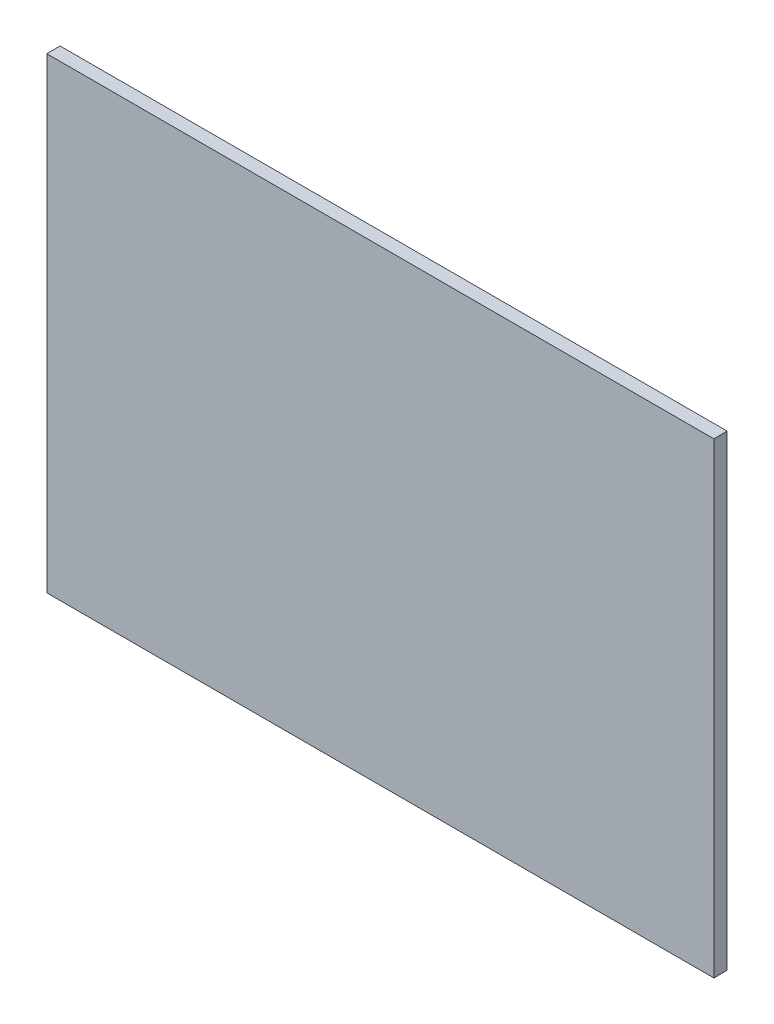
ISO-10303-21;
HEADER;
FILE_DESCRIPTION(('STEP AP214'),'2;1');
FILE_NAME('part.step','',(''),(''),'','','');
FILE_SCHEMA(('AUTOMOTIVE_DESIGN { 1 0 10303 214 1 1 1 1 }'));
ENDSEC;
DATA;
#1=APPLICATION_CONTEXT('core data for automotive mechanical design processes');
#2=APPLICATION_PROTOCOL_DEFINITION('international standard','automotive_design',2000,#1);
#3=PRODUCT_CONTEXT('',#1,'mechanical');
#4=PRODUCT('Part','Part','',(#3));
#5=PRODUCT_RELATED_PRODUCT_CATEGORY('part','',(#4));
#6=PRODUCT_DEFINITION_FORMATION('','',#4);
#7=PRODUCT_DEFINITION_CONTEXT('part definition',#1,'design');
#8=PRODUCT_DEFINITION('design','',#6,#7);
#9=PRODUCT_DEFINITION_SHAPE('','',#8);
#10=(LENGTH_UNIT() NAMED_UNIT(*) SI_UNIT(.MILLI.,.METRE.));
#11=(NAMED_UNIT(*) PLANE_ANGLE_UNIT() SI_UNIT($,.RADIAN.));
#12=(NAMED_UNIT(*) SI_UNIT($,.STERADIAN.) SOLID_ANGLE_UNIT());
#13=UNCERTAINTY_MEASURE_WITH_UNIT(LENGTH_MEASURE(1.E-05),#10,'distance_accuracy_value','');
#14=(GEOMETRIC_REPRESENTATION_CONTEXT(3) GLOBAL_UNCERTAINTY_ASSIGNED_CONTEXT((#13)) GLOBAL_UNIT_ASSIGNED_CONTEXT((#10,
#11,#12)) REPRESENTATION_CONTEXT('',''));
#15=CARTESIAN_POINT('',(0.,0.,0.));
#16=DIRECTION('',(0.,0.,1.));
#17=DIRECTION('',(1.,0.,0.));
#18=AXIS2_PLACEMENT_3D('',#15,#16,#17);
#19=CARTESIAN_POINT('',(528.664259927798,29.3862815884477,20.));
#20=DIRECTION('',(0.,-1.,0.));
#21=DIRECTION('',(1.,0.,0.));
#22=AXIS2_PLACEMENT_3D('',#19,#20,#21);
#23=PLANE('',#22);
#24=DIRECTION('',(-1.,0.,0.));
#25=VECTOR('',#24,1.);
#26=CARTESIAN_POINT('',(528.664259927798,29.3862815884477,0.));
#27=LINE('',#26,#25);
#28=CARTESIAN_POINT('',(528.664259927798,29.3862815884477,0.));
#29=VERTEX_POINT('',#28);
#30=CARTESIAN_POINT('',(-471.335740072202,29.3862815884476,0.));
#31=VERTEX_POINT('',#30);
#32=EDGE_CURVE('E107',#29,#31,#27,.T.);
#33=ORIENTED_EDGE('',*,*,#32,.T.);
#34=DIRECTION('',(0.,0.,-1.));
#35=VECTOR('',#34,1.);
#36=CARTESIAN_POINT('',(-471.335740072202,29.3862815884476,20.));
#37=LINE('',#36,#35);
#38=CARTESIAN_POINT('',(-471.335740072202,29.3862815884476,20.));
#39=VERTEX_POINT('',#38);
#40=EDGE_CURVE('E11',#39,#31,#37,.T.);
#41=ORIENTED_EDGE('',*,*,#40,.F.);
#42=DIRECTION('',(-1.,0.,0.));
#43=VECTOR('',#42,1.);
#44=CARTESIAN_POINT('',(528.664259927798,29.3862815884477,20.));
#45=LINE('',#44,#43);
#46=CARTESIAN_POINT('',(528.664259927798,29.3862815884477,20.));
#47=VERTEX_POINT('',#46);
#48=EDGE_CURVE('E91',#47,#39,#45,.T.);
#49=ORIENTED_EDGE('',*,*,#48,.F.);
#50=DIRECTION('',(0.,0.,-1.));
#51=VECTOR('',#50,1.);
#52=CARTESIAN_POINT('',(528.664259927798,29.3862815884477,20.));
#53=LINE('',#52,#51);
#54=EDGE_CURVE('E103',#47,#29,#53,.T.);
#55=ORIENTED_EDGE('',*,*,#54,.T.);
#56=EDGE_LOOP('',(#33,#41,#49,#55));
#57=FACE_BOUND('',#56,.T.);
#58=ADVANCED_FACE('F39',(#57),#23,.F.);
#59=CARTESIAN_POINT('',(-471.335740072202,29.3862815884476,20.));
#60=DIRECTION('',(1.,0.,0.));
#61=DIRECTION('',(0.,1.,0.));
#62=AXIS2_PLACEMENT_3D('',#59,#60,#61);
#63=PLANE('',#62);
#64=DIRECTION('',(0.,-1.,0.));
#65=VECTOR('',#64,1.);
#66=CARTESIAN_POINT('',(-471.335740072202,29.3862815884476,0.));
#67=LINE('',#66,#65);
#68=CARTESIAN_POINT('',(-471.335740072202,-670.613718411552,0.));
#69=VERTEX_POINT('',#68);
#70=EDGE_CURVE('E96',#31,#69,#67,.T.);
#71=ORIENTED_EDGE('',*,*,#70,.T.);
#72=DIRECTION('',(0.,0.,-1.));
#73=VECTOR('',#72,1.);
#74=CARTESIAN_POINT('',(-471.335740072202,-670.613718411552,20.));
#75=LINE('',#74,#73);
#76=CARTESIAN_POINT('',(-471.335740072202,-670.613718411552,20.));
#77=VERTEX_POINT('',#76);
#78=EDGE_CURVE('E48',#77,#69,#75,.T.);
#79=ORIENTED_EDGE('',*,*,#78,.F.);
#80=DIRECTION('',(0.,-1.,0.));
#81=VECTOR('',#80,1.);
#82=CARTESIAN_POINT('',(-471.335740072202,29.3862815884476,20.));
#83=LINE('',#82,#81);
#84=EDGE_CURVE('E86',#39,#77,#83,.T.);
#85=ORIENTED_EDGE('',*,*,#84,.F.);
#86=ORIENTED_EDGE('',*,*,#40,.T.);
#87=EDGE_LOOP('',(#71,#79,#85,#86));
#88=FACE_BOUND('',#87,.T.);
#89=ADVANCED_FACE('F95',(#88),#63,.F.);
#90=CARTESIAN_POINT('',(-471.335740072202,-670.613718411552,20.));
#91=DIRECTION('',(0.,1.,0.));
#92=DIRECTION('',(0.,0.,1.));
#93=AXIS2_PLACEMENT_3D('',#90,#91,#92);
#94=PLANE('',#93);
#95=DIRECTION('',(1.,0.,0.));
#96=VECTOR('',#95,1.);
#97=CARTESIAN_POINT('',(-471.335740072202,-670.613718411552,0.));
#98=LINE('',#97,#96);
#99=CARTESIAN_POINT('',(528.664259927798,-670.613718411552,0.));
#100=VERTEX_POINT('',#99);
#101=EDGE_CURVE('E73',#69,#100,#98,.T.);
#102=ORIENTED_EDGE('',*,*,#101,.T.);
#103=DIRECTION('',(0.,0.,-1.));
#104=VECTOR('',#103,1.);
#105=CARTESIAN_POINT('',(528.664259927798,-670.613718411552,20.));
#106=LINE('',#105,#104);
#107=CARTESIAN_POINT('',(528.664259927798,-670.613718411552,20.));
#108=VERTEX_POINT('',#107);
#109=EDGE_CURVE('E98',#108,#100,#106,.T.);
#110=ORIENTED_EDGE('',*,*,#109,.F.);
#111=DIRECTION('',(1.,0.,0.));
#112=VECTOR('',#111,1.);
#113=CARTESIAN_POINT('',(-471.335740072202,-670.613718411552,20.));
#114=LINE('',#113,#112);
#115=EDGE_CURVE('E89',#77,#108,#114,.T.);
#116=ORIENTED_EDGE('',*,*,#115,.F.);
#117=ORIENTED_EDGE('',*,*,#78,.T.);
#118=EDGE_LOOP('',(#102,#110,#116,#117));
#119=FACE_BOUND('',#118,.T.);
#120=ADVANCED_FACE('F99',(#119),#94,.F.);
#121=CARTESIAN_POINT('',(528.664259927798,-670.613718411552,20.));
#122=DIRECTION('',(-1.,0.,0.));
#123=DIRECTION('',(0.,0.,1.));
#124=AXIS2_PLACEMENT_3D('',#121,#122,#123);
#125=PLANE('',#124);
#126=DIRECTION('',(0.,1.,0.));
#127=VECTOR('',#126,1.);
#128=CARTESIAN_POINT('',(528.664259927798,-670.613718411552,0.));
#129=LINE('',#128,#127);
#130=EDGE_CURVE('E79',#100,#29,#129,.T.);
#131=ORIENTED_EDGE('',*,*,#130,.T.);
#132=ORIENTED_EDGE('',*,*,#54,.F.);
#133=DIRECTION('',(0.,1.,0.));
#134=VECTOR('',#133,1.);
#135=CARTESIAN_POINT('',(528.664259927798,-670.613718411552,20.));
#136=LINE('',#135,#134);
#137=EDGE_CURVE('E56',#108,#47,#136,.T.);
#138=ORIENTED_EDGE('',*,*,#137,.F.);
#139=ORIENTED_EDGE('',*,*,#109,.T.);
#140=EDGE_LOOP('',(#131,#132,#138,#139));
#141=FACE_BOUND('',#140,.T.);
#142=ADVANCED_FACE('F120',(#141),#125,.F.);
#143=CARTESIAN_POINT('',(0.,0.,20.));
#144=DIRECTION('',(0.,0.,1.));
#145=DIRECTION('',(1.,0.,0.));
#146=AXIS2_PLACEMENT_3D('',#143,#144,#145);
#147=PLANE('',#146);
#148=ORIENTED_EDGE('',*,*,#48,.T.);
#149=ORIENTED_EDGE('',*,*,#84,.T.);
#150=ORIENTED_EDGE('',*,*,#115,.T.);
#151=ORIENTED_EDGE('',*,*,#137,.T.);
#152=EDGE_LOOP('',(#148,#149,#150,#151));
#153=FACE_BOUND('',#152,.T.);
#154=ADVANCED_FACE('F87',(#153),#147,.T.);
#155=CARTESIAN_POINT('',(0.,0.,0.));
#156=DIRECTION('',(0.,0.,1.));
#157=DIRECTION('',(1.,0.,0.));
#158=AXIS2_PLACEMENT_3D('',#155,#156,#157);
#159=PLANE('',#158);
#160=ORIENTED_EDGE('',*,*,#32,.F.);
#161=ORIENTED_EDGE('',*,*,#130,.F.);
#162=ORIENTED_EDGE('',*,*,#101,.F.);
#163=ORIENTED_EDGE('',*,*,#70,.F.);
#164=EDGE_LOOP('',(#160,#161,#162,#163));
#165=FACE_BOUND('',#164,.T.);
#166=ADVANCED_FACE('F123',(#165),#159,.F.);
#167=CLOSED_SHELL('',(#58,#89,#120,#142,#154,#166));
#168=MANIFOLD_SOLID_BREP('B2',#167);
#169=ADVANCED_BREP_SHAPE_REPRESENTATION('',(#18,#168),#14);
#170=SHAPE_DEFINITION_REPRESENTATION(#9,#169);
ENDSEC;
END-ISO-10303-21;
